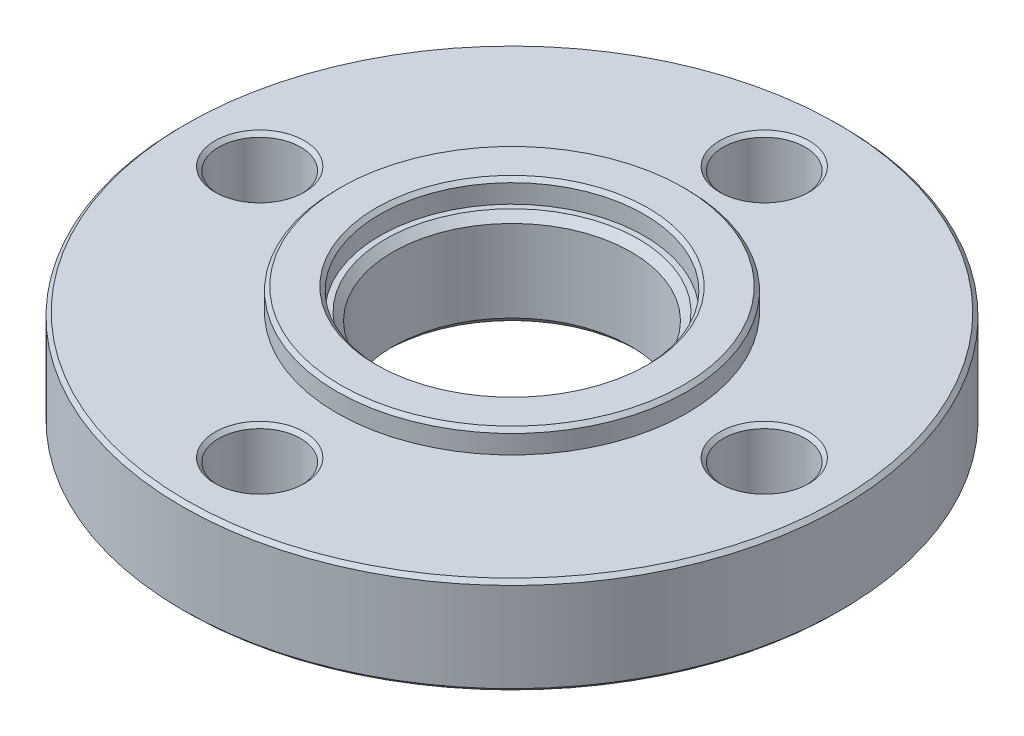
ISO-10303-21;
HEADER;
FILE_DESCRIPTION(('STEP AP214'),'2;1');
FILE_NAME('part.step','',(''),(''),'','','');
FILE_SCHEMA(('AUTOMOTIVE_DESIGN { 1 0 10303 214 1 1 1 1 }'));
ENDSEC;
DATA;
#1=APPLICATION_CONTEXT('core data for automotive mechanical design processes');
#2=APPLICATION_PROTOCOL_DEFINITION('international standard','automotive_design',2000,#1);
#3=PRODUCT_CONTEXT('',#1,'mechanical');
#4=PRODUCT('Part','Part','',(#3));
#5=PRODUCT_RELATED_PRODUCT_CATEGORY('part','',(#4));
#6=PRODUCT_DEFINITION_FORMATION('','',#4);
#7=PRODUCT_DEFINITION_CONTEXT('part definition',#1,'design');
#8=PRODUCT_DEFINITION('design','',#6,#7);
#9=PRODUCT_DEFINITION_SHAPE('','',#8);
#10=(LENGTH_UNIT() NAMED_UNIT(*) SI_UNIT(.MILLI.,.METRE.));
#11=(NAMED_UNIT(*) PLANE_ANGLE_UNIT() SI_UNIT($,.RADIAN.));
#12=(NAMED_UNIT(*) SI_UNIT($,.STERADIAN.) SOLID_ANGLE_UNIT());
#13=UNCERTAINTY_MEASURE_WITH_UNIT(LENGTH_MEASURE(1.E-05),#10,'distance_accuracy_value','');
#14=(GEOMETRIC_REPRESENTATION_CONTEXT(3) GLOBAL_UNCERTAINTY_ASSIGNED_CONTEXT((#13)) GLOBAL_UNIT_ASSIGNED_CONTEXT((#10,
#11,#12)) REPRESENTATION_CONTEXT('',''));
#15=CARTESIAN_POINT('',(0.,0.,0.));
#16=DIRECTION('',(0.,0.,1.));
#17=DIRECTION('',(1.,0.,0.));
#18=AXIS2_PLACEMENT_3D('',#15,#16,#17);
#19=CARTESIAN_POINT('',(0.,-6.5,44.25));
#20=DIRECTION('',(0.,-1.,0.));
#21=DIRECTION('',(0.,0.,-1.));
#22=AXIS2_PLACEMENT_3D('',#19,#20,#21);
#23=PLANE('',#22);
#24=CARTESIAN_POINT('',(33.875,-6.5,0.));
#25=DIRECTION('',(0.,-1.,0.));
#26=DIRECTION('',(0.,0.,-1.));
#27=AXIS2_PLACEMENT_3D('',#24,#25,#26);
#28=CIRCLE('',#27,5.99999999999999);
#29=CARTESIAN_POINT('',(33.875,-6.5,-5.99999999999999));
#30=VERTEX_POINT('',#29);
#31=EDGE_CURVE('E96',#30,#30,#28,.F.);
#32=ORIENTED_EDGE('',*,*,#31,.T.);
#33=EDGE_LOOP('',(#32));
#34=FACE_BOUND('',#33,.T.);
#35=CARTESIAN_POINT('',(0.,-6.5,-33.875));
#36=DIRECTION('',(0.,-1.,0.));
#37=DIRECTION('',(0.,0.,-1.));
#38=AXIS2_PLACEMENT_3D('',#35,#36,#37);
#39=CIRCLE('',#38,5.99999999999999);
#40=CARTESIAN_POINT('',(0.,-6.5,-39.875));
#41=VERTEX_POINT('',#40);
#42=EDGE_CURVE('E99',#41,#41,#39,.F.);
#43=ORIENTED_EDGE('',*,*,#42,.T.);
#44=EDGE_LOOP('',(#43));
#45=FACE_BOUND('',#44,.T.);
#46=CARTESIAN_POINT('',(-33.875,-6.5,0.));
#47=DIRECTION('',(0.,-1.,0.));
#48=DIRECTION('',(0.,0.,-1.));
#49=AXIS2_PLACEMENT_3D('',#46,#47,#48);
#50=CIRCLE('',#49,5.99999999999998);
#51=CARTESIAN_POINT('',(-33.875,-6.5,-5.99999999999997));
#52=VERTEX_POINT('',#51);
#53=EDGE_CURVE('E102',#52,#52,#50,.F.);
#54=ORIENTED_EDGE('',*,*,#53,.T.);
#55=EDGE_LOOP('',(#54));
#56=FACE_BOUND('',#55,.T.);
#57=CARTESIAN_POINT('',(0.,-6.5,33.875));
#58=DIRECTION('',(0.,-1.,0.));
#59=DIRECTION('',(0.,0.,-1.));
#60=AXIS2_PLACEMENT_3D('',#57,#58,#59);
#61=CIRCLE('',#60,5.99999999999999);
#62=CARTESIAN_POINT('',(0.,-6.5,27.875));
#63=VERTEX_POINT('',#62);
#64=EDGE_CURVE('E105',#63,#63,#61,.F.);
#65=ORIENTED_EDGE('',*,*,#64,.T.);
#66=EDGE_LOOP('',(#65));
#67=FACE_BOUND('',#66,.T.);
#68=CARTESIAN_POINT('',(0.,-6.5,0.));
#69=DIRECTION('',(0.,-1.,0.));
#70=DIRECTION('',(0.,0.,-1.));
#71=AXIS2_PLACEMENT_3D('',#68,#69,#70);
#72=CIRCLE('',#71,43.75);
#73=CARTESIAN_POINT('',(0.,-6.5,-43.75));
#74=VERTEX_POINT('',#73);
#75=EDGE_CURVE('E108',#74,#74,#72,.T.);
#76=ORIENTED_EDGE('',*,*,#75,.T.);
#77=EDGE_LOOP('',(#76));
#78=FACE_BOUND('',#77,.T.);
#79=CARTESIAN_POINT('',(0.,-6.5,0.));
#80=DIRECTION('',(0.,-1.,0.));
#81=DIRECTION('',(0.,0.,-1.));
#82=AXIS2_PLACEMENT_3D('',#79,#80,#81);
#83=CIRCLE('',#82,17.);
#84=CARTESIAN_POINT('',(0.,-6.5,-17.));
#85=VERTEX_POINT('',#84);
#86=EDGE_CURVE('E120',#85,#85,#83,.F.);
#87=ORIENTED_EDGE('',*,*,#86,.T.);
#88=EDGE_LOOP('',(#87));
#89=FACE_BOUND('',#88,.T.);
#90=ADVANCED_FACE('F31',(#34,#45,#56,#67,#78,#89),#23,.T.);
#91=CARTESIAN_POINT('',(0.,0.,0.));
#92=DIRECTION('',(0.,1.,0.));
#93=DIRECTION('',(0.,0.,1.));
#94=AXIS2_PLACEMENT_3D('',#91,#92,#93);
#95=CYLINDRICAL_SURFACE('',#94,16.);
#96=CARTESIAN_POINT('',(0.,-5.5,0.));
#97=DIRECTION('',(0.,-1.,0.));
#98=DIRECTION('',(0.,0.,-1.));
#99=AXIS2_PLACEMENT_3D('',#96,#97,#98);
#100=CIRCLE('',#99,16.);
#101=CARTESIAN_POINT('',(0.,-5.5,-16.));
#102=VERTEX_POINT('',#101);
#103=EDGE_CURVE('E114',#102,#102,#100,.T.);
#104=ORIENTED_EDGE('',*,*,#103,.T.);
#105=EDGE_LOOP('',(#104));
#106=FACE_BOUND('',#105,.T.);
#107=CARTESIAN_POINT('',(0.,5.49999999999998,0.));
#108=DIRECTION('',(0.,1.,0.));
#109=DIRECTION('',(0.,0.,1.));
#110=AXIS2_PLACEMENT_3D('',#107,#108,#109);
#111=CIRCLE('',#110,16.);
#112=CARTESIAN_POINT('',(0.,5.49999999999998,16.));
#113=VERTEX_POINT('',#112);
#114=EDGE_CURVE('E117',#113,#113,#111,.T.);
#115=ORIENTED_EDGE('',*,*,#114,.T.);
#116=EDGE_LOOP('',(#115));
#117=FACE_BOUND('',#116,.T.);
#118=ADVANCED_FACE('F148',(#106,#117),#95,.F.);
#119=CARTESIAN_POINT('',(0.,6.5,16.));
#120=DIRECTION('',(0.,1.,0.));
#121=DIRECTION('',(0.,0.,1.));
#122=AXIS2_PLACEMENT_3D('',#119,#120,#121);
#123=PLANE('',#122);
#124=CARTESIAN_POINT('',(0.,6.5,0.));
#125=DIRECTION('',(0.,1.,0.));
#126=DIRECTION('',(0.,0.,1.));
#127=AXIS2_PLACEMENT_3D('',#124,#125,#126);
#128=CIRCLE('',#127,17.);
#129=CARTESIAN_POINT('',(0.,6.5,17.));
#130=VERTEX_POINT('',#129);
#131=EDGE_CURVE('E111',#130,#130,#128,.F.);
#132=ORIENTED_EDGE('',*,*,#131,.T.);
#133=EDGE_LOOP('',(#132));
#134=FACE_BOUND('',#133,.T.);
#135=CARTESIAN_POINT('',(0.,6.5,0.));
#136=DIRECTION('',(0.,1.,0.));
#137=DIRECTION('',(0.,0.,1.));
#138=AXIS2_PLACEMENT_3D('',#135,#136,#137);
#139=CIRCLE('',#138,17.75);
#140=CARTESIAN_POINT('',(0.,6.5,17.75));
#141=VERTEX_POINT('',#140);
#142=EDGE_CURVE('E123',#141,#141,#139,.T.);
#143=ORIENTED_EDGE('',*,*,#142,.T.);
#144=EDGE_LOOP('',(#143));
#145=FACE_BOUND('',#144,.T.);
#146=ADVANCED_FACE('F154',(#134,#145),#123,.T.);
#147=CARTESIAN_POINT('',(0.,0.,0.));
#148=DIRECTION('',(0.,1.,0.));
#149=DIRECTION('',(0.,0.,1.));
#150=AXIS2_PLACEMENT_3D('',#147,#148,#149);
#151=CYLINDRICAL_SURFACE('',#150,17.75);
#152=CARTESIAN_POINT('',(0.,8.99999999999999,0.));
#153=DIRECTION('',(0.,1.,0.));
#154=DIRECTION('',(0.,0.,1.));
#155=AXIS2_PLACEMENT_3D('',#152,#153,#154);
#156=CIRCLE('',#155,17.75);
#157=CARTESIAN_POINT('',(0.,8.99999999999999,17.75));
#158=VERTEX_POINT('',#157);
#159=EDGE_CURVE('E54',#158,#158,#156,.T.);
#160=ORIENTED_EDGE('',*,*,#159,.T.);
#161=EDGE_LOOP('',(#160));
#162=FACE_BOUND('',#161,.T.);
#163=ORIENTED_EDGE('',*,*,#142,.F.);
#164=EDGE_LOOP('',(#163));
#165=FACE_BOUND('',#164,.T.);
#166=ADVANCED_FACE('F355',(#162,#165),#151,.F.);
#167=CARTESIAN_POINT('',(0.,9.5,17.75));
#168=DIRECTION('',(0.,1.,0.));
#169=DIRECTION('',(0.,0.,1.));
#170=AXIS2_PLACEMENT_3D('',#167,#168,#169);
#171=PLANE('',#170);
#172=CARTESIAN_POINT('',(0.,9.5,0.));
#173=DIRECTION('',(0.,1.,0.));
#174=DIRECTION('',(0.,0.,1.));
#175=AXIS2_PLACEMENT_3D('',#172,#173,#174);
#176=CIRCLE('',#175,18.25);
#177=CARTESIAN_POINT('',(0.,9.5,18.25));
#178=VERTEX_POINT('',#177);
#179=EDGE_CURVE('E46',#178,#178,#176,.F.);
#180=ORIENTED_EDGE('',*,*,#179,.T.);
#181=EDGE_LOOP('',(#180));
#182=FACE_BOUND('',#181,.T.);
#183=CARTESIAN_POINT('',(0.,9.5,0.));
#184=DIRECTION('',(0.,1.,0.));
#185=DIRECTION('',(0.,0.,1.));
#186=AXIS2_PLACEMENT_3D('',#183,#184,#185);
#187=CIRCLE('',#186,23.);
#188=CARTESIAN_POINT('',(0.,9.5,23.));
#189=VERTEX_POINT('',#188);
#190=EDGE_CURVE('E51',#189,#189,#187,.T.);
#191=ORIENTED_EDGE('',*,*,#190,.T.);
#192=EDGE_LOOP('',(#191));
#193=FACE_BOUND('',#192,.T.);
#194=ADVANCED_FACE('F143',(#182,#193),#171,.T.);
#195=CARTESIAN_POINT('',(0.,0.,0.));
#196=DIRECTION('',(0.,1.,0.));
#197=DIRECTION('',(0.,0.,1.));
#198=AXIS2_PLACEMENT_3D('',#195,#196,#197);
#199=CYLINDRICAL_SURFACE('',#198,23.5);
#200=CARTESIAN_POINT('',(0.,9.,0.));
#201=DIRECTION('',(0.,1.,0.));
#202=DIRECTION('',(0.,0.,1.));
#203=AXIS2_PLACEMENT_3D('',#200,#201,#202);
#204=CIRCLE('',#203,23.5);
#205=CARTESIAN_POINT('',(0.,9.,23.5));
#206=VERTEX_POINT('',#205);
#207=EDGE_CURVE('E42',#206,#206,#204,.F.);
#208=ORIENTED_EDGE('',*,*,#207,.T.);
#209=EDGE_LOOP('',(#208));
#210=FACE_BOUND('',#209,.T.);
#211=CARTESIAN_POINT('',(0.,6.5,0.));
#212=DIRECTION('',(0.,1.,0.));
#213=DIRECTION('',(0.,0.,1.));
#214=AXIS2_PLACEMENT_3D('',#211,#212,#213);
#215=CIRCLE('',#214,23.5);
#216=CARTESIAN_POINT('',(0.,6.5,23.5));
#217=VERTEX_POINT('',#216);
#218=EDGE_CURVE('E126',#217,#217,#215,.T.);
#219=ORIENTED_EDGE('',*,*,#218,.T.);
#220=EDGE_LOOP('',(#219));
#221=FACE_BOUND('',#220,.T.);
#222=ADVANCED_FACE('F130',(#210,#221),#199,.T.);
#223=CARTESIAN_POINT('',(0.,6.5,23.5));
#224=DIRECTION('',(0.,1.,0.));
#225=DIRECTION('',(0.,0.,1.));
#226=AXIS2_PLACEMENT_3D('',#223,#224,#225);
#227=PLANE('',#226);
#228=CARTESIAN_POINT('',(33.875,6.5,0.));
#229=DIRECTION('',(0.,1.,0.));
#230=DIRECTION('',(0.,0.,1.));
#231=AXIS2_PLACEMENT_3D('',#228,#229,#230);
#232=CIRCLE('',#231,6.00000000000002);
#233=CARTESIAN_POINT('',(33.875,6.5,6.00000000000002));
#234=VERTEX_POINT('',#233);
#235=EDGE_CURVE('E75',#234,#234,#232,.F.);
#236=ORIENTED_EDGE('',*,*,#235,.T.);
#237=EDGE_LOOP('',(#236));
#238=FACE_BOUND('',#237,.T.);
#239=CARTESIAN_POINT('',(0.,6.5,-33.875));
#240=DIRECTION('',(0.,1.,0.));
#241=DIRECTION('',(0.,0.,1.));
#242=AXIS2_PLACEMENT_3D('',#239,#240,#241);
#243=CIRCLE('',#242,6.00000000000005);
#244=CARTESIAN_POINT('',(0.,6.5,-27.875));
#245=VERTEX_POINT('',#244);
#246=EDGE_CURVE('E78',#245,#245,#243,.F.);
#247=ORIENTED_EDGE('',*,*,#246,.T.);
#248=EDGE_LOOP('',(#247));
#249=FACE_BOUND('',#248,.T.);
#250=CARTESIAN_POINT('',(-33.875,6.5,0.));
#251=DIRECTION('',(0.,1.,0.));
#252=DIRECTION('',(0.,0.,1.));
#253=AXIS2_PLACEMENT_3D('',#250,#251,#252);
#254=CIRCLE('',#253,6.00000000000001);
#255=CARTESIAN_POINT('',(-33.875,6.5,6.00000000000001));
#256=VERTEX_POINT('',#255);
#257=EDGE_CURVE('E81',#256,#256,#254,.F.);
#258=ORIENTED_EDGE('',*,*,#257,.T.);
#259=EDGE_LOOP('',(#258));
#260=FACE_BOUND('',#259,.T.);
#261=CARTESIAN_POINT('',(0.,6.5,33.875));
#262=DIRECTION('',(0.,1.,0.));
#263=DIRECTION('',(0.,0.,1.));
#264=AXIS2_PLACEMENT_3D('',#261,#262,#263);
#265=CIRCLE('',#264,6.00000000000001);
#266=CARTESIAN_POINT('',(0.,6.5,39.875));
#267=VERTEX_POINT('',#266);
#268=EDGE_CURVE('E84',#267,#267,#265,.F.);
#269=ORIENTED_EDGE('',*,*,#268,.T.);
#270=EDGE_LOOP('',(#269));
#271=FACE_BOUND('',#270,.T.);
#272=CARTESIAN_POINT('',(0.,6.5,0.));
#273=DIRECTION('',(0.,1.,0.));
#274=DIRECTION('',(0.,0.,1.));
#275=AXIS2_PLACEMENT_3D('',#272,#273,#274);
#276=CIRCLE('',#275,43.75);
#277=CARTESIAN_POINT('',(0.,6.5,43.75));
#278=VERTEX_POINT('',#277);
#279=EDGE_CURVE('E87',#278,#278,#276,.T.);
#280=ORIENTED_EDGE('',*,*,#279,.T.);
#281=EDGE_LOOP('',(#280));
#282=FACE_BOUND('',#281,.T.);
#283=ORIENTED_EDGE('',*,*,#218,.F.);
#284=EDGE_LOOP('',(#283));
#285=FACE_BOUND('',#284,.T.);
#286=ADVANCED_FACE('F132',(#238,#249,#260,#271,#282,#285),#227,.T.);
#287=CARTESIAN_POINT('',(0.,0.,0.));
#288=DIRECTION('',(0.,1.,0.));
#289=DIRECTION('',(0.,0.,1.));
#290=AXIS2_PLACEMENT_3D('',#287,#288,#289);
#291=CYLINDRICAL_SURFACE('',#290,44.25);
#292=CARTESIAN_POINT('',(0.,6.00000000000007,0.));
#293=DIRECTION('',(0.,1.,0.));
#294=DIRECTION('',(0.,0.,1.));
#295=AXIS2_PLACEMENT_3D('',#292,#293,#294);
#296=CIRCLE('',#295,44.25);
#297=CARTESIAN_POINT('',(0.,6.00000000000007,44.25));
#298=VERTEX_POINT('',#297);
#299=EDGE_CURVE('E10',#298,#298,#296,.F.);
#300=ORIENTED_EDGE('',*,*,#299,.T.);
#301=EDGE_LOOP('',(#300));
#302=FACE_BOUND('',#301,.T.);
#303=CARTESIAN_POINT('',(0.,-6.,0.));
#304=DIRECTION('',(0.,-1.,0.));
#305=DIRECTION('',(0.,0.,-1.));
#306=AXIS2_PLACEMENT_3D('',#303,#304,#305);
#307=CIRCLE('',#306,44.25);
#308=CARTESIAN_POINT('',(0.,-6.,-44.25));
#309=VERTEX_POINT('',#308);
#310=EDGE_CURVE('E38',#309,#309,#307,.F.);
#311=ORIENTED_EDGE('',*,*,#310,.T.);
#312=EDGE_LOOP('',(#311));
#313=FACE_BOUND('',#312,.T.);
#314=ADVANCED_FACE('F134',(#302,#313),#291,.T.);
#315=CARTESIAN_POINT('',(-33.875,-6.5,0.));
#316=DIRECTION('',(0.,1.,0.));
#317=DIRECTION('',(0.,0.,1.));
#318=AXIS2_PLACEMENT_3D('',#315,#316,#317);
#319=CYLINDRICAL_SURFACE('',#318,5.5);
#320=CARTESIAN_POINT('',(-33.875,-6.,0.));
#321=DIRECTION('',(0.,-1.,0.));
#322=DIRECTION('',(0.,0.,-1.));
#323=AXIS2_PLACEMENT_3D('',#320,#321,#322);
#324=CIRCLE('',#323,5.5);
#325=CARTESIAN_POINT('',(-33.875,-6.,-5.5));
#326=VERTEX_POINT('',#325);
#327=EDGE_CURVE('E63',#326,#326,#324,.T.);
#328=ORIENTED_EDGE('',*,*,#327,.T.);
#329=EDGE_LOOP('',(#328));
#330=FACE_BOUND('',#329,.T.);
#331=CARTESIAN_POINT('',(-33.875,6.00000000000001,0.));
#332=DIRECTION('',(0.,1.,0.));
#333=DIRECTION('',(0.,0.,1.));
#334=AXIS2_PLACEMENT_3D('',#331,#332,#333);
#335=CIRCLE('',#334,5.5);
#336=CARTESIAN_POINT('',(-33.875,6.00000000000001,5.50000000000001));
#337=VERTEX_POINT('',#336);
#338=EDGE_CURVE('E66',#337,#337,#335,.T.);
#339=ORIENTED_EDGE('',*,*,#338,.T.);
#340=EDGE_LOOP('',(#339));
#341=FACE_BOUND('',#340,.T.);
#342=ADVANCED_FACE('F141',(#330,#341),#319,.F.);
#343=CARTESIAN_POINT('',(0.,-6.5,33.875));
#344=DIRECTION('',(0.,1.,0.));
#345=DIRECTION('',(0.,0.,1.));
#346=AXIS2_PLACEMENT_3D('',#343,#344,#345);
#347=CYLINDRICAL_SURFACE('',#346,5.49999999999999);
#348=CARTESIAN_POINT('',(0.,-5.99999999999999,33.875));
#349=DIRECTION('',(0.,-1.,0.));
#350=DIRECTION('',(0.,0.,-1.));
#351=AXIS2_PLACEMENT_3D('',#348,#349,#350);
#352=CIRCLE('',#351,5.49999999999999);
#353=CARTESIAN_POINT('',(0.,-5.99999999999999,28.375));
#354=VERTEX_POINT('',#353);
#355=EDGE_CURVE('E57',#354,#354,#352,.T.);
#356=ORIENTED_EDGE('',*,*,#355,.T.);
#357=EDGE_LOOP('',(#356));
#358=FACE_BOUND('',#357,.T.);
#359=CARTESIAN_POINT('',(0.,5.99999999999999,33.875));
#360=DIRECTION('',(0.,1.,0.));
#361=DIRECTION('',(0.,0.,1.));
#362=AXIS2_PLACEMENT_3D('',#359,#360,#361);
#363=CIRCLE('',#362,5.49999999999999);
#364=CARTESIAN_POINT('',(0.,5.99999999999999,39.375));
#365=VERTEX_POINT('',#364);
#366=EDGE_CURVE('E60',#365,#365,#363,.T.);
#367=ORIENTED_EDGE('',*,*,#366,.T.);
#368=EDGE_LOOP('',(#367));
#369=FACE_BOUND('',#368,.T.);
#370=ADVANCED_FACE('F311',(#358,#369),#347,.F.);
#371=CARTESIAN_POINT('',(33.875,-6.5,0.));
#372=DIRECTION('',(0.,1.,0.));
#373=DIRECTION('',(0.,0.,1.));
#374=AXIS2_PLACEMENT_3D('',#371,#372,#373);
#375=CYLINDRICAL_SURFACE('',#374,5.50000000000001);
#376=CARTESIAN_POINT('',(33.875,-6.00000000000001,0.));
#377=DIRECTION('',(0.,-1.,0.));
#378=DIRECTION('',(0.,0.,-1.));
#379=AXIS2_PLACEMENT_3D('',#376,#377,#378);
#380=CIRCLE('',#379,5.50000000000001);
#381=CARTESIAN_POINT('',(33.875,-6.00000000000001,-5.50000000000001));
#382=VERTEX_POINT('',#381);
#383=EDGE_CURVE('E90',#382,#382,#380,.T.);
#384=ORIENTED_EDGE('',*,*,#383,.T.);
#385=EDGE_LOOP('',(#384));
#386=FACE_BOUND('',#385,.T.);
#387=CARTESIAN_POINT('',(33.875,5.99999999999998,0.));
#388=DIRECTION('',(0.,1.,0.));
#389=DIRECTION('',(0.,0.,1.));
#390=AXIS2_PLACEMENT_3D('',#387,#388,#389);
#391=CIRCLE('',#390,5.50000000000001);
#392=CARTESIAN_POINT('',(33.875,5.99999999999998,5.50000000000001));
#393=VERTEX_POINT('',#392);
#394=EDGE_CURVE('E93',#393,#393,#391,.T.);
#395=ORIENTED_EDGE('',*,*,#394,.T.);
#396=EDGE_LOOP('',(#395));
#397=FACE_BOUND('',#396,.T.);
#398=ADVANCED_FACE('F300',(#386,#397),#375,.F.);
#399=CARTESIAN_POINT('',(0.,-6.5,-33.875));
#400=DIRECTION('',(0.,1.,0.));
#401=DIRECTION('',(0.,0.,1.));
#402=AXIS2_PLACEMENT_3D('',#399,#400,#401);
#403=CYLINDRICAL_SURFACE('',#402,5.5);
#404=CARTESIAN_POINT('',(0.,-6.00000000000002,-33.875));
#405=DIRECTION('',(0.,-1.,0.));
#406=DIRECTION('',(0.,0.,-1.));
#407=AXIS2_PLACEMENT_3D('',#404,#405,#406);
#408=CIRCLE('',#407,5.5);
#409=CARTESIAN_POINT('',(0.,-6.00000000000002,-39.375));
#410=VERTEX_POINT('',#409);
#411=EDGE_CURVE('E69',#410,#410,#408,.T.);
#412=ORIENTED_EDGE('',*,*,#411,.T.);
#413=EDGE_LOOP('',(#412));
#414=FACE_BOUND('',#413,.T.);
#415=CARTESIAN_POINT('',(0.,5.99999999999997,-33.875));
#416=DIRECTION('',(0.,1.,0.));
#417=DIRECTION('',(0.,0.,1.));
#418=AXIS2_PLACEMENT_3D('',#415,#416,#417);
#419=CIRCLE('',#418,5.5);
#420=CARTESIAN_POINT('',(0.,5.99999999999997,-28.375));
#421=VERTEX_POINT('',#420);
#422=EDGE_CURVE('E72',#421,#421,#419,.T.);
#423=ORIENTED_EDGE('',*,*,#422,.T.);
#424=EDGE_LOOP('',(#423));
#425=FACE_BOUND('',#424,.T.);
#426=ADVANCED_FACE('F164',(#414,#425),#403,.F.);
#427=CARTESIAN_POINT('',(0.,-6.5,0.));
#428=DIRECTION('',(0.,-1.,0.));
#429=DIRECTION('',(0.,0.,-1.));
#430=AXIS2_PLACEMENT_3D('',#427,#428,#429);
#431=CONICAL_SURFACE('',#430,17.,0.785398163397441);
#432=ORIENTED_EDGE('',*,*,#103,.F.);
#433=EDGE_LOOP('',(#432));
#434=FACE_BOUND('',#433,.T.);
#435=ORIENTED_EDGE('',*,*,#86,.F.);
#436=EDGE_LOOP('',(#435));
#437=FACE_BOUND('',#436,.T.);
#438=ADVANCED_FACE('F160',(#434,#437),#431,.F.);
#439=CARTESIAN_POINT('',(0.,5.49999999999998,0.));
#440=DIRECTION('',(0.,1.,0.));
#441=DIRECTION('',(0.,0.,1.));
#442=AXIS2_PLACEMENT_3D('',#439,#440,#441);
#443=CONICAL_SURFACE('',#442,16.,0.785398163397455);
#444=ORIENTED_EDGE('',*,*,#131,.F.);
#445=EDGE_LOOP('',(#444));
#446=FACE_BOUND('',#445,.T.);
#447=ORIENTED_EDGE('',*,*,#114,.F.);
#448=EDGE_LOOP('',(#447));
#449=FACE_BOUND('',#448,.T.);
#450=ADVANCED_FACE('F163',(#446,#449),#443,.F.);
#451=CARTESIAN_POINT('',(33.875,-6.5,0.));
#452=DIRECTION('',(0.,-1.,0.));
#453=DIRECTION('',(0.,0.,-1.));
#454=AXIS2_PLACEMENT_3D('',#451,#452,#453);
#455=CONICAL_SURFACE('',#454,5.99999999999999,0.785398163397441);
#456=ORIENTED_EDGE('',*,*,#383,.F.);
#457=EDGE_LOOP('',(#456));
#458=FACE_BOUND('',#457,.T.);
#459=ORIENTED_EDGE('',*,*,#31,.F.);
#460=EDGE_LOOP('',(#459));
#461=FACE_BOUND('',#460,.T.);
#462=ADVANCED_FACE('F168',(#458,#461),#455,.F.);
#463=CARTESIAN_POINT('',(33.875,5.99999999999998,0.));
#464=DIRECTION('',(0.,1.,0.));
#465=DIRECTION('',(0.,0.,1.));
#466=AXIS2_PLACEMENT_3D('',#463,#464,#465);
#467=CONICAL_SURFACE('',#466,5.50000000000001,0.785398163397441);
#468=ORIENTED_EDGE('',*,*,#235,.F.);
#469=EDGE_LOOP('',(#468));
#470=FACE_BOUND('',#469,.T.);
#471=ORIENTED_EDGE('',*,*,#394,.F.);
#472=EDGE_LOOP('',(#471));
#473=FACE_BOUND('',#472,.T.);
#474=ADVANCED_FACE('F172',(#470,#473),#467,.F.);
#475=CARTESIAN_POINT('',(0.,-6.5,-33.875));
#476=DIRECTION('',(0.,-1.,0.));
#477=DIRECTION('',(0.,0.,-1.));
#478=AXIS2_PLACEMENT_3D('',#475,#476,#477);
#479=CONICAL_SURFACE('',#478,5.99999999999999,0.785398163397457);
#480=ORIENTED_EDGE('',*,*,#411,.F.);
#481=EDGE_LOOP('',(#480));
#482=FACE_BOUND('',#481,.T.);
#483=ORIENTED_EDGE('',*,*,#42,.F.);
#484=EDGE_LOOP('',(#483));
#485=FACE_BOUND('',#484,.T.);
#486=ADVANCED_FACE('F176',(#482,#485),#479,.F.);
#487=CARTESIAN_POINT('',(0.,5.99999999999997,-33.875));
#488=DIRECTION('',(0.,1.,0.));
#489=DIRECTION('',(0.,0.,1.));
#490=AXIS2_PLACEMENT_3D('',#487,#488,#489);
#491=CONICAL_SURFACE('',#490,5.5,0.785398163397458);
#492=ORIENTED_EDGE('',*,*,#246,.F.);
#493=EDGE_LOOP('',(#492));
#494=FACE_BOUND('',#493,.T.);
#495=ORIENTED_EDGE('',*,*,#422,.F.);
#496=EDGE_LOOP('',(#495));
#497=FACE_BOUND('',#496,.T.);
#498=ADVANCED_FACE('F180',(#494,#497),#491,.F.);
#499=CARTESIAN_POINT('',(-33.875,-6.5,0.));
#500=DIRECTION('',(0.,-1.,0.));
#501=DIRECTION('',(0.,0.,-1.));
#502=AXIS2_PLACEMENT_3D('',#499,#500,#501);
#503=CONICAL_SURFACE('',#502,5.99999999999998,0.785398163397426);
#504=ORIENTED_EDGE('',*,*,#327,.F.);
#505=EDGE_LOOP('',(#504));
#506=FACE_BOUND('',#505,.T.);
#507=ORIENTED_EDGE('',*,*,#53,.F.);
#508=EDGE_LOOP('',(#507));
#509=FACE_BOUND('',#508,.T.);
#510=ADVANCED_FACE('F184',(#506,#509),#503,.F.);
#511=CARTESIAN_POINT('',(-33.875,6.00000000000001,0.));
#512=DIRECTION('',(0.,1.,0.));
#513=DIRECTION('',(0.,0.,1.));
#514=AXIS2_PLACEMENT_3D('',#511,#512,#513);
#515=CONICAL_SURFACE('',#514,5.5,0.785398163397457);
#516=ORIENTED_EDGE('',*,*,#257,.F.);
#517=EDGE_LOOP('',(#516));
#518=FACE_BOUND('',#517,.T.);
#519=ORIENTED_EDGE('',*,*,#338,.F.);
#520=EDGE_LOOP('',(#519));
#521=FACE_BOUND('',#520,.T.);
#522=ADVANCED_FACE('F188',(#518,#521),#515,.F.);
#523=CARTESIAN_POINT('',(0.,-6.5,33.875));
#524=DIRECTION('',(0.,-1.,0.));
#525=DIRECTION('',(0.,0.,-1.));
#526=AXIS2_PLACEMENT_3D('',#523,#524,#525);
#527=CONICAL_SURFACE('',#526,5.99999999999999,0.785398163397436);
#528=ORIENTED_EDGE('',*,*,#355,.F.);
#529=EDGE_LOOP('',(#528));
#530=FACE_BOUND('',#529,.T.);
#531=ORIENTED_EDGE('',*,*,#64,.F.);
#532=EDGE_LOOP('',(#531));
#533=FACE_BOUND('',#532,.T.);
#534=ADVANCED_FACE('F192',(#530,#533),#527,.F.);
#535=CARTESIAN_POINT('',(0.,5.99999999999999,33.875));
#536=DIRECTION('',(0.,1.,0.));
#537=DIRECTION('',(0.,0.,1.));
#538=AXIS2_PLACEMENT_3D('',#535,#536,#537);
#539=CONICAL_SURFACE('',#538,5.49999999999999,0.785398163397457);
#540=ORIENTED_EDGE('',*,*,#268,.F.);
#541=EDGE_LOOP('',(#540));
#542=FACE_BOUND('',#541,.T.);
#543=ORIENTED_EDGE('',*,*,#366,.F.);
#544=EDGE_LOOP('',(#543));
#545=FACE_BOUND('',#544,.T.);
#546=ADVANCED_FACE('F196',(#542,#545),#539,.F.);
#547=CARTESIAN_POINT('',(0.,8.99999999999999,0.));
#548=DIRECTION('',(0.,1.,0.));
#549=DIRECTION('',(0.,0.,1.));
#550=AXIS2_PLACEMENT_3D('',#547,#548,#549);
#551=CONICAL_SURFACE('',#550,17.75,0.785398163397455);
#552=ORIENTED_EDGE('',*,*,#179,.F.);
#553=EDGE_LOOP('',(#552));
#554=FACE_BOUND('',#553,.T.);
#555=ORIENTED_EDGE('',*,*,#159,.F.);
#556=EDGE_LOOP('',(#555));
#557=FACE_BOUND('',#556,.T.);
#558=ADVANCED_FACE('F200',(#554,#557),#551,.F.);
#559=CARTESIAN_POINT('',(0.,9.5,0.));
#560=DIRECTION('',(0.,-1.,0.));
#561=DIRECTION('',(0.,0.,-1.));
#562=AXIS2_PLACEMENT_3D('',#559,#560,#561);
#563=CONICAL_SURFACE('',#562,23.,0.785398163397452);
#564=ORIENTED_EDGE('',*,*,#207,.F.);
#565=EDGE_LOOP('',(#564));
#566=FACE_BOUND('',#565,.T.);
#567=ORIENTED_EDGE('',*,*,#190,.F.);
#568=EDGE_LOOP('',(#567));
#569=FACE_BOUND('',#568,.T.);
#570=ADVANCED_FACE('F204',(#566,#569),#563,.T.);
#571=CARTESIAN_POINT('',(0.,6.5,0.));
#572=DIRECTION('',(0.,-1.,0.));
#573=DIRECTION('',(0.,0.,-1.));
#574=AXIS2_PLACEMENT_3D('',#571,#572,#573);
#575=CONICAL_SURFACE('',#574,43.75,0.785398163397483);
#576=ORIENTED_EDGE('',*,*,#299,.F.);
#577=EDGE_LOOP('',(#576));
#578=FACE_BOUND('',#577,.T.);
#579=ORIENTED_EDGE('',*,*,#279,.F.);
#580=EDGE_LOOP('',(#579));
#581=FACE_BOUND('',#580,.T.);
#582=ADVANCED_FACE('F207',(#578,#581),#575,.T.);
#583=CARTESIAN_POINT('',(0.,-6.,0.));
#584=DIRECTION('',(0.,1.,0.));
#585=DIRECTION('',(0.,0.,1.));
#586=AXIS2_PLACEMENT_3D('',#583,#584,#585);
#587=CONICAL_SURFACE('',#586,44.25,0.785398163397455);
#588=ORIENTED_EDGE('',*,*,#75,.F.);
#589=EDGE_LOOP('',(#588));
#590=FACE_BOUND('',#589,.T.);
#591=ORIENTED_EDGE('',*,*,#310,.F.);
#592=EDGE_LOOP('',(#591));
#593=FACE_BOUND('',#592,.T.);
#594=ADVANCED_FACE('F33',(#590,#593),#587,.T.);
#595=CLOSED_SHELL('',(#90,#118,#146,#166,#194,#222,#286,#314,#342,#370,#398,#426,#438,#450,#462,
#474,#486,#498,#510,#522,#534,#546,#558,#570,#582,#594));
#596=MANIFOLD_SOLID_BREP('B2',#595);
#597=ADVANCED_BREP_SHAPE_REPRESENTATION('',(#18,#596),#14);
#598=SHAPE_DEFINITION_REPRESENTATION(#9,#597);
ENDSEC;
END-ISO-10303-21;
